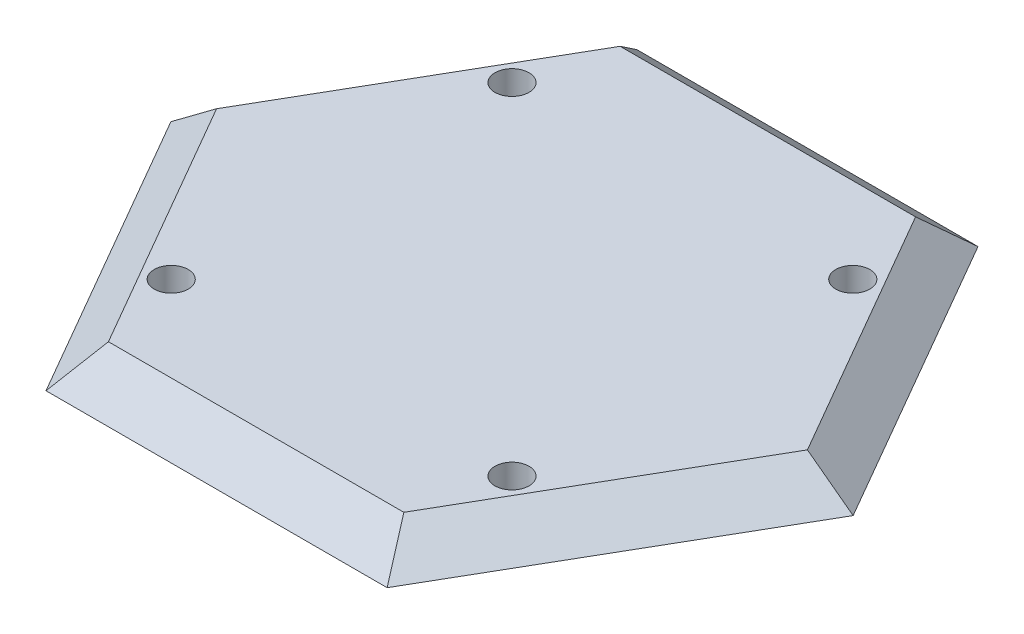
ISO-10303-21;
HEADER;
FILE_DESCRIPTION(('STEP AP214'),'2;1');
FILE_NAME('part.step','',(''),(''),'','','');
FILE_SCHEMA(('AUTOMOTIVE_DESIGN { 1 0 10303 214 1 1 1 1 }'));
ENDSEC;
DATA;
#1=APPLICATION_CONTEXT('core data for automotive mechanical design processes');
#2=APPLICATION_PROTOCOL_DEFINITION('international standard','automotive_design',2000,#1);
#3=PRODUCT_CONTEXT('',#1,'mechanical');
#4=PRODUCT('Part','Part','',(#3));
#5=PRODUCT_RELATED_PRODUCT_CATEGORY('part','',(#4));
#6=PRODUCT_DEFINITION_FORMATION('','',#4);
#7=PRODUCT_DEFINITION_CONTEXT('part definition',#1,'design');
#8=PRODUCT_DEFINITION('design','',#6,#7);
#9=PRODUCT_DEFINITION_SHAPE('','',#8);
#10=(LENGTH_UNIT() NAMED_UNIT(*) SI_UNIT(.MILLI.,.METRE.));
#11=(NAMED_UNIT(*) PLANE_ANGLE_UNIT() SI_UNIT($,.RADIAN.));
#12=(NAMED_UNIT(*) SI_UNIT($,.STERADIAN.) SOLID_ANGLE_UNIT());
#13=UNCERTAINTY_MEASURE_WITH_UNIT(LENGTH_MEASURE(1.E-05),#10,'distance_accuracy_value','');
#14=(GEOMETRIC_REPRESENTATION_CONTEXT(3) GLOBAL_UNCERTAINTY_ASSIGNED_CONTEXT((#13)) GLOBAL_UNIT_ASSIGNED_CONTEXT((#10,
#11,#12)) REPRESENTATION_CONTEXT('',''));
#15=CARTESIAN_POINT('',(0.,0.,0.));
#16=DIRECTION('',(0.,0.,1.));
#17=DIRECTION('',(1.,0.,0.));
#18=AXIS2_PLACEMENT_3D('',#15,#16,#17);
#19=CARTESIAN_POINT('',(0.,5.,0.));
#20=DIRECTION('',(0.,1.,0.));
#21=DIRECTION('',(0.,0.,1.));
#22=AXIS2_PLACEMENT_3D('',#19,#20,#21);
#23=PLANE('',#22);
#24=CARTESIAN_POINT('',(25.,5.,25.));
#25=DIRECTION('',(0.,1.,0.));
#26=DIRECTION('',(0.,0.,1.));
#27=AXIS2_PLACEMENT_3D('',#24,#25,#26);
#28=CIRCLE('',#27,2.5);
#29=CARTESIAN_POINT('',(25.,5.,27.5));
#30=VERTEX_POINT('',#29);
#31=EDGE_CURVE('E414',#30,#30,#28,.T.);
#32=ORIENTED_EDGE('',*,*,#31,.F.);
#33=EDGE_LOOP('',(#32));
#34=FACE_BOUND('',#33,.T.);
#35=CARTESIAN_POINT('',(-25.,5.,25.));
#36=DIRECTION('',(0.,1.,0.));
#37=DIRECTION('',(0.,0.,1.));
#38=AXIS2_PLACEMENT_3D('',#35,#36,#37);
#39=CIRCLE('',#38,2.5);
#40=CARTESIAN_POINT('',(-25.,5.,27.5));
#41=VERTEX_POINT('',#40);
#42=EDGE_CURVE('E408',#41,#41,#39,.T.);
#43=ORIENTED_EDGE('',*,*,#42,.F.);
#44=EDGE_LOOP('',(#43));
#45=FACE_BOUND('',#44,.T.);
#46=CARTESIAN_POINT('',(25.,5.,-25.));
#47=DIRECTION('',(0.,1.,0.));
#48=DIRECTION('',(0.,0.,1.));
#49=AXIS2_PLACEMENT_3D('',#46,#47,#48);
#50=CIRCLE('',#49,2.5);
#51=CARTESIAN_POINT('',(25.,5.,-22.5));
#52=VERTEX_POINT('',#51);
#53=EDGE_CURVE('E402',#52,#52,#50,.T.);
#54=ORIENTED_EDGE('',*,*,#53,.F.);
#55=EDGE_LOOP('',(#54));
#56=FACE_BOUND('',#55,.T.);
#57=CARTESIAN_POINT('',(-25.,5.,-25.));
#58=DIRECTION('',(0.,1.,0.));
#59=DIRECTION('',(0.,0.,1.));
#60=AXIS2_PLACEMENT_3D('',#57,#58,#59);
#61=CIRCLE('',#60,2.5);
#62=CARTESIAN_POINT('',(-25.,5.,-22.5));
#63=VERTEX_POINT('',#62);
#64=EDGE_CURVE('E396',#63,#63,#61,.T.);
#65=ORIENTED_EDGE('',*,*,#64,.F.);
#66=EDGE_LOOP('',(#65));
#67=FACE_BOUND('',#66,.T.);
#68=DIRECTION('',(0.499999999999995,0.,-0.866025403784441));
#69=VECTOR('',#68,1.);
#70=CARTESIAN_POINT('',(21.6729614972971,5.,37.5386704638017));
#71=LINE('',#70,#69);
#72=CARTESIAN_POINT('',(21.6729614972971,5.,37.5386704638017));
#73=VERTEX_POINT('',#72);
#74=CARTESIAN_POINT('',(43.3459229945934,5.,0.));
#75=VERTEX_POINT('',#74);
#76=EDGE_CURVE('E227',#73,#75,#71,.T.);
#77=ORIENTED_EDGE('',*,*,#76,.T.);
#78=DIRECTION('',(-0.500000000000001,0.,-0.866025403784438));
#79=VECTOR('',#78,1.);
#80=CARTESIAN_POINT('',(43.3459229945934,5.,0.));
#81=LINE('',#80,#79);
#82=CARTESIAN_POINT('',(21.6729614972966,5.,-37.538670463802));
#83=VERTEX_POINT('',#82);
#84=EDGE_CURVE('E140',#75,#83,#81,.T.);
#85=ORIENTED_EDGE('',*,*,#84,.T.);
#86=DIRECTION('',(-1.,0.,0.));
#87=VECTOR('',#86,1.);
#88=CARTESIAN_POINT('',(21.6729614972966,5.,-37.538670463802));
#89=LINE('',#88,#87);
#90=CARTESIAN_POINT('',(-21.6729614972969,5.,-37.5386704638018));
#91=VERTEX_POINT('',#90);
#92=EDGE_CURVE('E184',#83,#91,#89,.T.);
#93=ORIENTED_EDGE('',*,*,#92,.T.);
#94=DIRECTION('',(-0.499999999999995,0.,0.866025403784442));
#95=VECTOR('',#94,1.);
#96=CARTESIAN_POINT('',(-21.6729614972969,5.,-37.5386704638018));
#97=LINE('',#96,#95);
#98=CARTESIAN_POINT('',(-43.3459229945934,5.,3.12250225675825E-13));
#99=VERTEX_POINT('',#98);
#100=EDGE_CURVE('E198',#91,#99,#97,.T.);
#101=ORIENTED_EDGE('',*,*,#100,.T.);
#102=DIRECTION('',(0.500000000000007,0.,0.866025403784435));
#103=VECTOR('',#102,1.);
#104=CARTESIAN_POINT('',(-43.3459229945934,5.,3.02682962501109E-13));
#105=LINE('',#104,#103);
#106=CARTESIAN_POINT('',(-21.6729614972963,5.,37.5386704638021));
#107=VERTEX_POINT('',#106);
#108=EDGE_CURVE('E62',#99,#107,#105,.T.);
#109=ORIENTED_EDGE('',*,*,#108,.T.);
#110=DIRECTION('',(1.,0.,0.));
#111=VECTOR('',#110,1.);
#112=CARTESIAN_POINT('',(-21.6729614972963,5.,37.5386704638021));
#113=LINE('',#112,#111);
#114=EDGE_CURVE('E12',#107,#73,#113,.T.);
#115=ORIENTED_EDGE('',*,*,#114,.T.);
#116=EDGE_LOOP('',(#77,#85,#93,#101,#109,#115));
#117=FACE_BOUND('',#116,.T.);
#118=ADVANCED_FACE('F52',(#34,#45,#56,#67,#117),#23,.T.);
#119=CARTESIAN_POINT('',(0.,0.,0.));
#120=DIRECTION('',(0.,1.,0.));
#121=DIRECTION('',(0.,0.,1.));
#122=AXIS2_PLACEMENT_3D('',#119,#120,#121);
#123=PLANE('',#122);
#124=CARTESIAN_POINT('',(25.,0.,25.));
#125=DIRECTION('',(0.,1.,0.));
#126=DIRECTION('',(0.,0.,1.));
#127=AXIS2_PLACEMENT_3D('',#124,#125,#126);
#128=CIRCLE('',#127,2.5);
#129=CARTESIAN_POINT('',(25.,0.,27.5));
#130=VERTEX_POINT('',#129);
#131=EDGE_CURVE('E411',#130,#130,#128,.T.);
#132=ORIENTED_EDGE('',*,*,#131,.T.);
#133=EDGE_LOOP('',(#132));
#134=FACE_BOUND('',#133,.T.);
#135=CARTESIAN_POINT('',(-25.,0.,25.));
#136=DIRECTION('',(0.,1.,0.));
#137=DIRECTION('',(0.,0.,1.));
#138=AXIS2_PLACEMENT_3D('',#135,#136,#137);
#139=CIRCLE('',#138,2.5);
#140=CARTESIAN_POINT('',(-25.,0.,27.5));
#141=VERTEX_POINT('',#140);
#142=EDGE_CURVE('E405',#141,#141,#139,.T.);
#143=ORIENTED_EDGE('',*,*,#142,.T.);
#144=EDGE_LOOP('',(#143));
#145=FACE_BOUND('',#144,.T.);
#146=CARTESIAN_POINT('',(25.,0.,-25.));
#147=DIRECTION('',(0.,1.,0.));
#148=DIRECTION('',(0.,0.,1.));
#149=AXIS2_PLACEMENT_3D('',#146,#147,#148);
#150=CIRCLE('',#149,2.5);
#151=CARTESIAN_POINT('',(25.,0.,-22.5));
#152=VERTEX_POINT('',#151);
#153=EDGE_CURVE('E399',#152,#152,#150,.T.);
#154=ORIENTED_EDGE('',*,*,#153,.T.);
#155=EDGE_LOOP('',(#154));
#156=FACE_BOUND('',#155,.T.);
#157=CARTESIAN_POINT('',(-25.,0.,-25.));
#158=DIRECTION('',(0.,1.,0.));
#159=DIRECTION('',(0.,0.,1.));
#160=AXIS2_PLACEMENT_3D('',#157,#158,#159);
#161=CIRCLE('',#160,2.5);
#162=CARTESIAN_POINT('',(-25.,0.,-22.5));
#163=VERTEX_POINT('',#162);
#164=EDGE_CURVE('E134',#163,#163,#161,.T.);
#165=ORIENTED_EDGE('',*,*,#164,.T.);
#166=EDGE_LOOP('',(#165));
#167=FACE_BOUND('',#166,.T.);
#168=DIRECTION('',(0.499999999999995,0.,-0.866025403784442));
#169=VECTOR('',#168,1.);
#170=CARTESIAN_POINT('',(25.0257803092017,0.,43.3459229945929));
#171=LINE('',#170,#169);
#172=CARTESIAN_POINT('',(25.0257803092017,0.,43.3459229945929));
#173=VERTEX_POINT('',#172);
#174=CARTESIAN_POINT('',(50.0515606184024,0.,0.));
#175=VERTEX_POINT('',#174);
#176=EDGE_CURVE('E113',#173,#175,#171,.T.);
#177=ORIENTED_EDGE('',*,*,#176,.F.);
#178=DIRECTION('',(1.,0.,0.));
#179=VECTOR('',#178,1.);
#180=CARTESIAN_POINT('',(-25.0257803092008,0.,43.3459229945935));
#181=LINE('',#180,#179);
#182=CARTESIAN_POINT('',(-25.0257803092008,0.,43.3459229945935));
#183=VERTEX_POINT('',#182);
#184=EDGE_CURVE('E261',#183,#173,#181,.T.);
#185=ORIENTED_EDGE('',*,*,#184,.F.);
#186=DIRECTION('',(0.500000000000007,0.,0.866025403784435));
#187=VECTOR('',#186,1.);
#188=CARTESIAN_POINT('',(-50.0515606184024,0.,3.49508179758256E-13));
#189=LINE('',#188,#187);
#190=CARTESIAN_POINT('',(-50.0515606184024,0.,3.49508179758256E-13));
#191=VERTEX_POINT('',#190);
#192=EDGE_CURVE('E232',#191,#183,#189,.T.);
#193=ORIENTED_EDGE('',*,*,#192,.F.);
#194=DIRECTION('',(-0.499999999999995,0.,0.866025403784442));
#195=VECTOR('',#194,1.);
#196=CARTESIAN_POINT('',(-25.0257803092014,0.,-43.3459229945931));
#197=LINE('',#196,#195);
#198=CARTESIAN_POINT('',(-25.0257803092014,0.,-43.3459229945931));
#199=VERTEX_POINT('',#198);
#200=EDGE_CURVE('E308',#199,#191,#197,.T.);
#201=ORIENTED_EDGE('',*,*,#200,.F.);
#202=DIRECTION('',(-1.,0.,0.));
#203=VECTOR('',#202,1.);
#204=CARTESIAN_POINT('',(25.0257803092011,0.,-43.3459229945933));
#205=LINE('',#204,#203);
#206=CARTESIAN_POINT('',(25.0257803092011,0.,-43.3459229945933));
#207=VERTEX_POINT('',#206);
#208=EDGE_CURVE('E116',#207,#199,#205,.T.);
#209=ORIENTED_EDGE('',*,*,#208,.F.);
#210=DIRECTION('',(-0.500000000000001,0.,-0.866025403784438));
#211=VECTOR('',#210,1.);
#212=CARTESIAN_POINT('',(50.0515606184024,0.,0.));
#213=LINE('',#212,#211);
#214=EDGE_CURVE('E109',#175,#207,#213,.T.);
#215=ORIENTED_EDGE('',*,*,#214,.F.);
#216=EDGE_LOOP('',(#177,#185,#193,#201,#209,#215));
#217=FACE_BOUND('',#216,.T.);
#218=ADVANCED_FACE('F112',(#134,#145,#156,#167,#217),#123,.F.);
#219=CARTESIAN_POINT('',(1.92011233161568E-13,21.4324587098382,18.4531829778356));
#220=DIRECTION('',(0.,-0.757813301751453,-0.65247145507567));
#221=DIRECTION('',(0.,0.65247145507567,-0.757813301751453));
#222=AXIS2_PLACEMENT_3D('',#219,#220,#221);
#223=PLANE('',#222);
#224=DIRECTION('',(-0.400837068986103,0.597761303955473,-0.694270169040902));
#225=VECTOR('',#224,1.);
#226=CARTESIAN_POINT('',(25.0257803092017,0.,43.3459229945929));
#227=LINE('',#226,#225);
#228=EDGE_CURVE('E132',#173,#73,#227,.T.);
#229=ORIENTED_EDGE('',*,*,#228,.T.);
#230=ORIENTED_EDGE('',*,*,#114,.F.);
#231=DIRECTION('',(0.400837068986088,0.597761303955473,-0.69427016904091));
#232=VECTOR('',#231,1.);
#233=CARTESIAN_POINT('',(-25.0257803092008,0.,43.3459229945935));
#234=LINE('',#233,#232);
#235=EDGE_CURVE('E77',#183,#107,#234,.T.);
#236=ORIENTED_EDGE('',*,*,#235,.F.);
#237=ORIENTED_EDGE('',*,*,#184,.T.);
#238=EDGE_LOOP('',(#229,#230,#236,#237));
#239=FACE_BOUND('',#238,.T.);
#240=ADVANCED_FACE('F246',(#239),#223,.F.);
#241=CARTESIAN_POINT('',(-15.9809252394882,21.4324587098382,9.22659148891794));
#242=DIRECTION('',(0.565056855339724,-0.757813301751453,-0.326235727537839));
#243=DIRECTION('',(0.80167413797219,0.597761303955472,0.));
#244=AXIS2_PLACEMENT_3D('',#241,#242,#243);
#245=PLANE('',#244);
#246=ORIENTED_EDGE('',*,*,#235,.T.);
#247=ORIENTED_EDGE('',*,*,#108,.F.);
#248=DIRECTION('',(0.801674137972189,0.597761303955473,0.));
#249=VECTOR('',#248,1.);
#250=CARTESIAN_POINT('',(-50.0515606184024,0.,3.49508179758256E-13));
#251=LINE('',#250,#249);
#252=EDGE_CURVE('E220',#191,#99,#251,.T.);
#253=ORIENTED_EDGE('',*,*,#252,.F.);
#254=ORIENTED_EDGE('',*,*,#192,.T.);
#255=EDGE_LOOP('',(#246,#247,#253,#254));
#256=FACE_BOUND('',#255,.T.);
#257=ADVANCED_FACE('F237',(#256),#245,.F.);
#258=CARTESIAN_POINT('',(15.9809252394883,21.4324587098383,9.22659148891771));
#259=DIRECTION('',(-0.565056855339727,-0.757813301751454,-0.326235727537831));
#260=DIRECTION('',(0.801674137972189,-0.597761303955473,0.));
#261=AXIS2_PLACEMENT_3D('',#258,#259,#260);
#262=PLANE('',#261);
#263=DIRECTION('',(-0.801674137972189,0.597761303955473,0.));
#264=VECTOR('',#263,1.);
#265=CARTESIAN_POINT('',(50.0515606184024,0.,0.));
#266=LINE('',#265,#264);
#267=EDGE_CURVE('E130',#175,#75,#266,.T.);
#268=ORIENTED_EDGE('',*,*,#267,.T.);
#269=ORIENTED_EDGE('',*,*,#76,.F.);
#270=ORIENTED_EDGE('',*,*,#228,.F.);
#271=ORIENTED_EDGE('',*,*,#176,.T.);
#272=EDGE_LOOP('',(#268,#269,#270,#271));
#273=FACE_BOUND('',#272,.T.);
#274=ADVANCED_FACE('F129',(#273),#262,.F.);
#275=CARTESIAN_POINT('',(15.9809252394882,21.4324587098382,-9.22659148891784));
#276=DIRECTION('',(-0.565056855339726,-0.757813301751453,0.326235727537835));
#277=DIRECTION('',(0.801674137972189,-0.597761303955473,0.));
#278=AXIS2_PLACEMENT_3D('',#275,#276,#277);
#279=PLANE('',#278);
#280=DIRECTION('',(-0.400837068986093,0.597761303955473,0.694270169040908));
#281=VECTOR('',#280,1.);
#282=CARTESIAN_POINT('',(25.0257803092011,0.,-43.3459229945933));
#283=LINE('',#282,#281);
#284=EDGE_CURVE('E142',#207,#83,#283,.T.);
#285=ORIENTED_EDGE('',*,*,#284,.T.);
#286=ORIENTED_EDGE('',*,*,#84,.F.);
#287=ORIENTED_EDGE('',*,*,#267,.F.);
#288=ORIENTED_EDGE('',*,*,#214,.T.);
#289=EDGE_LOOP('',(#285,#286,#287,#288));
#290=FACE_BOUND('',#289,.T.);
#291=ADVANCED_FACE('F138',(#290),#279,.F.);
#292=CARTESIAN_POINT('',(0.,21.4324587098382,-18.4531829778356));
#293=DIRECTION('',(0.,-0.757813301751453,0.652471455075669));
#294=DIRECTION('',(0.,-0.652471455075669,-0.757813301751453));
#295=AXIS2_PLACEMENT_3D('',#292,#293,#294);
#296=PLANE('',#295);
#297=DIRECTION('',(0.400837068986098,0.597761303955473,0.694270169040905));
#298=VECTOR('',#297,1.);
#299=CARTESIAN_POINT('',(-25.0257803092014,0.,-43.3459229945931));
#300=LINE('',#299,#298);
#301=EDGE_CURVE('E144',#199,#91,#300,.T.);
#302=ORIENTED_EDGE('',*,*,#301,.T.);
#303=ORIENTED_EDGE('',*,*,#92,.F.);
#304=ORIENTED_EDGE('',*,*,#284,.F.);
#305=ORIENTED_EDGE('',*,*,#208,.T.);
#306=EDGE_LOOP('',(#302,#303,#304,#305));
#307=FACE_BOUND('',#306,.T.);
#308=ADVANCED_FACE('F165',(#307),#296,.F.);
#309=CARTESIAN_POINT('',(-15.9809252394883,21.4324587098382,-9.22659148891772));
#310=DIRECTION('',(0.565056855339729,-0.757813301751453,0.326235727537831));
#311=DIRECTION('',(0.801674137972188,0.597761303955475,0.));
#312=AXIS2_PLACEMENT_3D('',#309,#310,#311);
#313=PLANE('',#312);
#314=ORIENTED_EDGE('',*,*,#252,.T.);
#315=ORIENTED_EDGE('',*,*,#100,.F.);
#316=ORIENTED_EDGE('',*,*,#301,.F.);
#317=ORIENTED_EDGE('',*,*,#200,.T.);
#318=EDGE_LOOP('',(#314,#315,#316,#317));
#319=FACE_BOUND('',#318,.T.);
#320=ADVANCED_FACE('F203',(#319),#313,.F.);
#321=CARTESIAN_POINT('',(-25.,0.,-25.));
#322=DIRECTION('',(0.,1.,0.));
#323=DIRECTION('',(0.,0.,1.));
#324=AXIS2_PLACEMENT_3D('',#321,#322,#323);
#325=CYLINDRICAL_SURFACE('',#324,2.5);
#326=ORIENTED_EDGE('',*,*,#164,.F.);
#327=EDGE_LOOP('',(#326));
#328=FACE_BOUND('',#327,.T.);
#329=ORIENTED_EDGE('',*,*,#64,.T.);
#330=EDGE_LOOP('',(#329));
#331=FACE_BOUND('',#330,.T.);
#332=ADVANCED_FACE('F211',(#328,#331),#325,.F.);
#333=CARTESIAN_POINT('',(25.,0.,-25.));
#334=DIRECTION('',(0.,1.,0.));
#335=DIRECTION('',(0.,0.,1.));
#336=AXIS2_PLACEMENT_3D('',#333,#334,#335);
#337=CYLINDRICAL_SURFACE('',#336,2.5);
#338=ORIENTED_EDGE('',*,*,#153,.F.);
#339=EDGE_LOOP('',(#338));
#340=FACE_BOUND('',#339,.T.);
#341=ORIENTED_EDGE('',*,*,#53,.T.);
#342=EDGE_LOOP('',(#341));
#343=FACE_BOUND('',#342,.T.);
#344=ADVANCED_FACE('F437',(#340,#343),#337,.F.);
#345=CARTESIAN_POINT('',(-25.,0.,25.));
#346=DIRECTION('',(0.,1.,0.));
#347=DIRECTION('',(0.,0.,1.));
#348=AXIS2_PLACEMENT_3D('',#345,#346,#347);
#349=CYLINDRICAL_SURFACE('',#348,2.5);
#350=ORIENTED_EDGE('',*,*,#142,.F.);
#351=EDGE_LOOP('',(#350));
#352=FACE_BOUND('',#351,.T.);
#353=ORIENTED_EDGE('',*,*,#42,.T.);
#354=EDGE_LOOP('',(#353));
#355=FACE_BOUND('',#354,.T.);
#356=ADVANCED_FACE('F424',(#352,#355),#349,.F.);
#357=CARTESIAN_POINT('',(25.,0.,25.));
#358=DIRECTION('',(0.,1.,0.));
#359=DIRECTION('',(0.,0.,1.));
#360=AXIS2_PLACEMENT_3D('',#357,#358,#359);
#361=CYLINDRICAL_SURFACE('',#360,2.5);
#362=ORIENTED_EDGE('',*,*,#131,.F.);
#363=EDGE_LOOP('',(#362));
#364=FACE_BOUND('',#363,.T.);
#365=ORIENTED_EDGE('',*,*,#31,.T.);
#366=EDGE_LOOP('',(#365));
#367=FACE_BOUND('',#366,.T.);
#368=ADVANCED_FACE('F421',(#364,#367),#361,.F.);
#369=CLOSED_SHELL('',(#118,#218,#240,#257,#274,#291,#308,#320,#332,#344,#356,#368));
#370=MANIFOLD_SOLID_BREP('B2',#369);
#371=ADVANCED_BREP_SHAPE_REPRESENTATION('',(#18,#370),#14);
#372=SHAPE_DEFINITION_REPRESENTATION(#9,#371);
ENDSEC;
END-ISO-10303-21;
